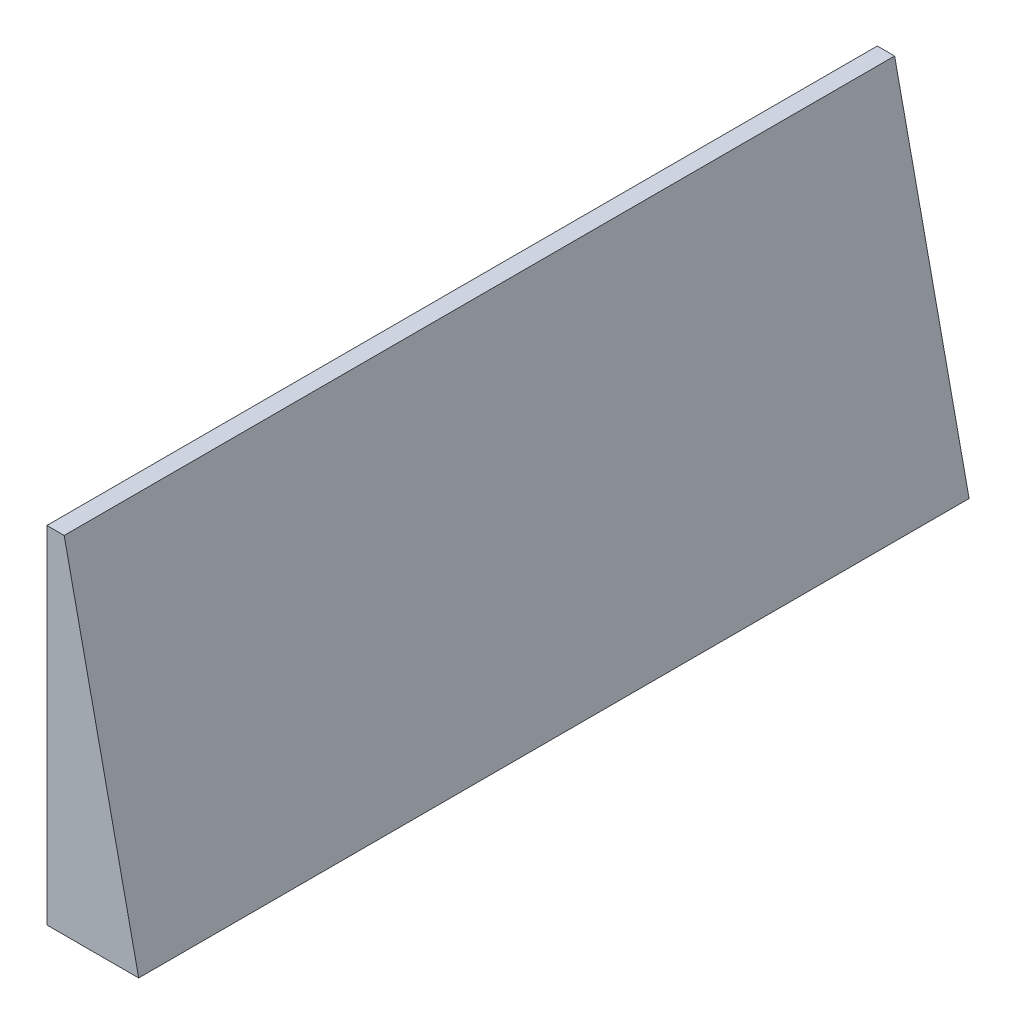
ISO-10303-21;
HEADER;
FILE_DESCRIPTION(('STEP AP214'),'2;1');
FILE_NAME('part.step','',(''),(''),'','','');
FILE_SCHEMA(('AUTOMOTIVE_DESIGN { 1 0 10303 214 1 1 1 1 }'));
ENDSEC;
DATA;
#1=APPLICATION_CONTEXT('core data for automotive mechanical design processes');
#2=APPLICATION_PROTOCOL_DEFINITION('international standard','automotive_design',2000,#1);
#3=PRODUCT_CONTEXT('',#1,'mechanical');
#4=PRODUCT('Part','Part','',(#3));
#5=PRODUCT_RELATED_PRODUCT_CATEGORY('part','',(#4));
#6=PRODUCT_DEFINITION_FORMATION('','',#4);
#7=PRODUCT_DEFINITION_CONTEXT('part definition',#1,'design');
#8=PRODUCT_DEFINITION('design','',#6,#7);
#9=PRODUCT_DEFINITION_SHAPE('','',#8);
#10=(LENGTH_UNIT() NAMED_UNIT(*) SI_UNIT(.MILLI.,.METRE.));
#11=(NAMED_UNIT(*) PLANE_ANGLE_UNIT() SI_UNIT($,.RADIAN.));
#12=(NAMED_UNIT(*) SI_UNIT($,.STERADIAN.) SOLID_ANGLE_UNIT());
#13=UNCERTAINTY_MEASURE_WITH_UNIT(LENGTH_MEASURE(1.E-05),#10,'distance_accuracy_value','');
#14=(GEOMETRIC_REPRESENTATION_CONTEXT(3) GLOBAL_UNCERTAINTY_ASSIGNED_CONTEXT((#13)) GLOBAL_UNIT_ASSIGNED_CONTEXT((#10,
#11,#12)) REPRESENTATION_CONTEXT('',''));
#15=CARTESIAN_POINT('',(0.,0.,0.));
#16=DIRECTION('',(0.,0.,1.));
#17=DIRECTION('',(1.,0.,0.));
#18=AXIS2_PLACEMENT_3D('',#15,#16,#17);
#19=CARTESIAN_POINT('',(-1.5875,-31.75,76.2));
#20=DIRECTION('',(1.,0.,0.));
#21=DIRECTION('',(0.,0.,-1.));
#22=AXIS2_PLACEMENT_3D('',#19,#20,#21);
#23=PLANE('',#22);
#24=DIRECTION('',(0.,-1.,0.));
#25=VECTOR('',#24,1.);
#26=CARTESIAN_POINT('',(-1.5875,-31.75,-76.2));
#27=LINE('',#26,#25);
#28=CARTESIAN_POINT('',(-1.5875,31.75,-76.2));
#29=VERTEX_POINT('',#28);
#30=CARTESIAN_POINT('',(-1.5875,-31.75,-76.2));
#31=VERTEX_POINT('',#30);
#32=EDGE_CURVE('E107',#29,#31,#27,.T.);
#33=ORIENTED_EDGE('',*,*,#32,.T.);
#34=DIRECTION('',(0.,0.,-1.));
#35=VECTOR('',#34,1.);
#36=CARTESIAN_POINT('',(-1.5875,-31.75,76.2));
#37=LINE('',#36,#35);
#38=CARTESIAN_POINT('',(-1.5875,-31.75,76.2));
#39=VERTEX_POINT('',#38);
#40=EDGE_CURVE('E11',#39,#31,#37,.T.);
#41=ORIENTED_EDGE('',*,*,#40,.F.);
#42=DIRECTION('',(0.,-1.,0.));
#43=VECTOR('',#42,1.);
#44=CARTESIAN_POINT('',(-1.5875,-31.75,76.2));
#45=LINE('',#44,#43);
#46=CARTESIAN_POINT('',(-1.5875,31.75,76.2));
#47=VERTEX_POINT('',#46);
#48=EDGE_CURVE('E91',#47,#39,#45,.T.);
#49=ORIENTED_EDGE('',*,*,#48,.F.);
#50=DIRECTION('',(0.,0.,-1.));
#51=VECTOR('',#50,1.);
#52=CARTESIAN_POINT('',(-1.5875,31.75,76.2));
#53=LINE('',#52,#51);
#54=EDGE_CURVE('E103',#47,#29,#53,.T.);
#55=ORIENTED_EDGE('',*,*,#54,.T.);
#56=EDGE_LOOP('',(#33,#41,#49,#55));
#57=FACE_BOUND('',#56,.T.);
#58=ADVANCED_FACE('F39',(#57),#23,.F.);
#59=CARTESIAN_POINT('',(15.2586923071624,-31.75,76.2));
#60=DIRECTION('',(0.,1.,0.));
#61=DIRECTION('',(0.,0.,1.));
#62=AXIS2_PLACEMENT_3D('',#59,#60,#61);
#63=PLANE('',#62);
#64=DIRECTION('',(1.,0.,0.));
#65=VECTOR('',#64,1.);
#66=CARTESIAN_POINT('',(15.2586923071624,-31.75,-76.2));
#67=LINE('',#66,#65);
#68=CARTESIAN_POINT('',(15.2586923071624,-31.75,-76.2));
#69=VERTEX_POINT('',#68);
#70=EDGE_CURVE('E96',#31,#69,#67,.T.);
#71=ORIENTED_EDGE('',*,*,#70,.T.);
#72=DIRECTION('',(0.,0.,-1.));
#73=VECTOR('',#72,1.);
#74=CARTESIAN_POINT('',(15.2586923071624,-31.75,76.2));
#75=LINE('',#74,#73);
#76=CARTESIAN_POINT('',(15.2586923071624,-31.75,76.2));
#77=VERTEX_POINT('',#76);
#78=EDGE_CURVE('E48',#77,#69,#75,.T.);
#79=ORIENTED_EDGE('',*,*,#78,.F.);
#80=DIRECTION('',(1.,0.,0.));
#81=VECTOR('',#80,1.);
#82=CARTESIAN_POINT('',(15.2586923071624,-31.75,76.2));
#83=LINE('',#82,#81);
#84=EDGE_CURVE('E86',#39,#77,#83,.T.);
#85=ORIENTED_EDGE('',*,*,#84,.F.);
#86=ORIENTED_EDGE('',*,*,#40,.T.);
#87=EDGE_LOOP('',(#71,#79,#85,#86));
#88=FACE_BOUND('',#87,.T.);
#89=ADVANCED_FACE('F95',(#88),#63,.F.);
#90=CARTESIAN_POINT('',(1.5875,31.75,76.2));
#91=DIRECTION('',(-0.977599937764792,-0.210471759821299,0.));
#92=DIRECTION('',(0.210471759821299,-0.977599937764792,0.));
#93=AXIS2_PLACEMENT_3D('',#90,#91,#92);
#94=PLANE('',#93);
#95=DIRECTION('',(-0.210471759821299,0.977599937764792,0.));
#96=VECTOR('',#95,1.);
#97=CARTESIAN_POINT('',(1.5875,31.75,-76.2));
#98=LINE('',#97,#96);
#99=CARTESIAN_POINT('',(1.5875,31.75,-76.2));
#100=VERTEX_POINT('',#99);
#101=EDGE_CURVE('E73',#69,#100,#98,.T.);
#102=ORIENTED_EDGE('',*,*,#101,.T.);
#103=DIRECTION('',(0.,0.,-1.));
#104=VECTOR('',#103,1.);
#105=CARTESIAN_POINT('',(1.5875,31.75,76.2));
#106=LINE('',#105,#104);
#107=CARTESIAN_POINT('',(1.5875,31.75,76.2));
#108=VERTEX_POINT('',#107);
#109=EDGE_CURVE('E98',#108,#100,#106,.T.);
#110=ORIENTED_EDGE('',*,*,#109,.F.);
#111=DIRECTION('',(-0.210471759821299,0.977599937764792,0.));
#112=VECTOR('',#111,1.);
#113=CARTESIAN_POINT('',(1.5875,31.75,76.2));
#114=LINE('',#113,#112);
#115=EDGE_CURVE('E89',#77,#108,#114,.T.);
#116=ORIENTED_EDGE('',*,*,#115,.F.);
#117=ORIENTED_EDGE('',*,*,#78,.T.);
#118=EDGE_LOOP('',(#102,#110,#116,#117));
#119=FACE_BOUND('',#118,.T.);
#120=ADVANCED_FACE('F99',(#119),#94,.F.);
#121=CARTESIAN_POINT('',(-1.5875,31.75,76.2));
#122=DIRECTION('',(0.,-1.,0.));
#123=DIRECTION('',(0.,0.,-1.));
#124=AXIS2_PLACEMENT_3D('',#121,#122,#123);
#125=PLANE('',#124);
#126=DIRECTION('',(-1.,0.,0.));
#127=VECTOR('',#126,1.);
#128=CARTESIAN_POINT('',(-1.5875,31.75,-76.2));
#129=LINE('',#128,#127);
#130=EDGE_CURVE('E79',#100,#29,#129,.T.);
#131=ORIENTED_EDGE('',*,*,#130,.T.);
#132=ORIENTED_EDGE('',*,*,#54,.F.);
#133=DIRECTION('',(-1.,0.,0.));
#134=VECTOR('',#133,1.);
#135=CARTESIAN_POINT('',(-1.5875,31.75,76.2));
#136=LINE('',#135,#134);
#137=EDGE_CURVE('E56',#108,#47,#136,.T.);
#138=ORIENTED_EDGE('',*,*,#137,.F.);
#139=ORIENTED_EDGE('',*,*,#109,.T.);
#140=EDGE_LOOP('',(#131,#132,#138,#139));
#141=FACE_BOUND('',#140,.T.);
#142=ADVANCED_FACE('F120',(#141),#125,.F.);
#143=CARTESIAN_POINT('',(0.,0.,76.2));
#144=DIRECTION('',(0.,0.,-1.));
#145=DIRECTION('',(-1.,0.,0.));
#146=AXIS2_PLACEMENT_3D('',#143,#144,#145);
#147=PLANE('',#146);
#148=ORIENTED_EDGE('',*,*,#48,.T.);
#149=ORIENTED_EDGE('',*,*,#84,.T.);
#150=ORIENTED_EDGE('',*,*,#115,.T.);
#151=ORIENTED_EDGE('',*,*,#137,.T.);
#152=EDGE_LOOP('',(#148,#149,#150,#151));
#153=FACE_BOUND('',#152,.T.);
#154=ADVANCED_FACE('F87',(#153),#147,.F.);
#155=CARTESIAN_POINT('',(0.,0.,-76.2));
#156=DIRECTION('',(0.,0.,-1.));
#157=DIRECTION('',(-1.,0.,0.));
#158=AXIS2_PLACEMENT_3D('',#155,#156,#157);
#159=PLANE('',#158);
#160=ORIENTED_EDGE('',*,*,#32,.F.);
#161=ORIENTED_EDGE('',*,*,#130,.F.);
#162=ORIENTED_EDGE('',*,*,#101,.F.);
#163=ORIENTED_EDGE('',*,*,#70,.F.);
#164=EDGE_LOOP('',(#160,#161,#162,#163));
#165=FACE_BOUND('',#164,.T.);
#166=ADVANCED_FACE('F123',(#165),#159,.T.);
#167=CLOSED_SHELL('',(#58,#89,#120,#142,#154,#166));
#168=MANIFOLD_SOLID_BREP('B2',#167);
#169=ADVANCED_BREP_SHAPE_REPRESENTATION('',(#18,#168),#14);
#170=SHAPE_DEFINITION_REPRESENTATION(#9,#169);
ENDSEC;
END-ISO-10303-21;
